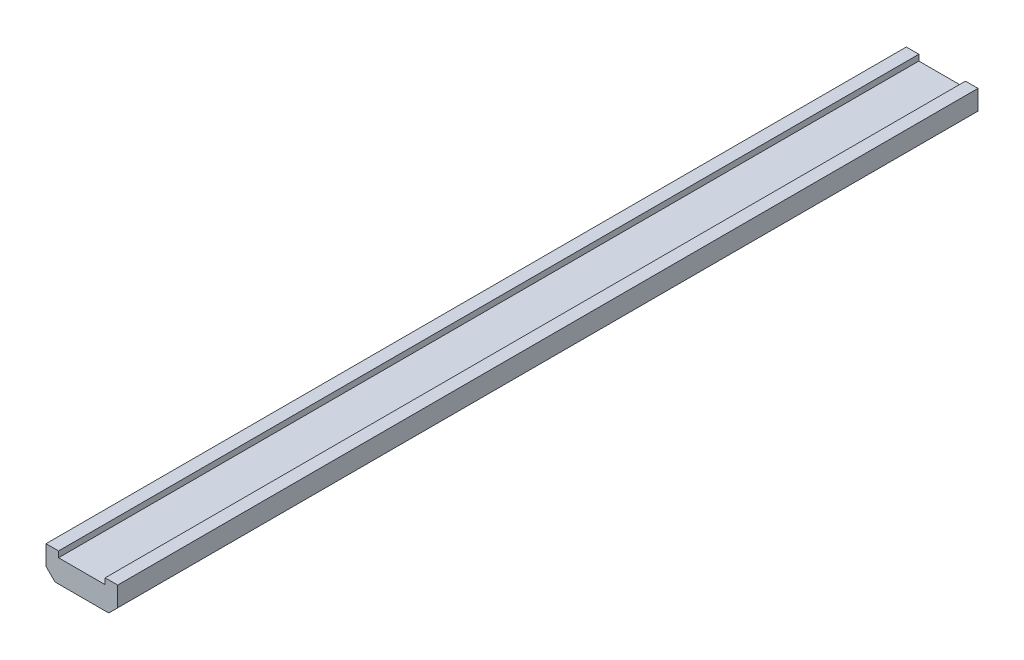
ISO-10303-21;
HEADER;
FILE_DESCRIPTION(('STEP AP214'),'2;1');
FILE_NAME('part.step','',(''),(''),'','','');
FILE_SCHEMA(('AUTOMOTIVE_DESIGN { 1 0 10303 214 1 1 1 1 }'));
ENDSEC;
DATA;
#1=APPLICATION_CONTEXT('core data for automotive mechanical design processes');
#2=APPLICATION_PROTOCOL_DEFINITION('international standard','automotive_design',2000,#1);
#3=PRODUCT_CONTEXT('',#1,'mechanical');
#4=PRODUCT('Part','Part','',(#3));
#5=PRODUCT_RELATED_PRODUCT_CATEGORY('part','',(#4));
#6=PRODUCT_DEFINITION_FORMATION('','',#4);
#7=PRODUCT_DEFINITION_CONTEXT('part definition',#1,'design');
#8=PRODUCT_DEFINITION('design','',#6,#7);
#9=PRODUCT_DEFINITION_SHAPE('','',#8);
#10=(LENGTH_UNIT() NAMED_UNIT(*) SI_UNIT(.MILLI.,.METRE.));
#11=(NAMED_UNIT(*) PLANE_ANGLE_UNIT() SI_UNIT($,.RADIAN.));
#12=(NAMED_UNIT(*) SI_UNIT($,.STERADIAN.) SOLID_ANGLE_UNIT());
#13=UNCERTAINTY_MEASURE_WITH_UNIT(LENGTH_MEASURE(1.E-05),#10,'distance_accuracy_value','');
#14=(GEOMETRIC_REPRESENTATION_CONTEXT(3) GLOBAL_UNCERTAINTY_ASSIGNED_CONTEXT((#13)) GLOBAL_UNIT_ASSIGNED_CONTEXT((#10,
#11,#12)) REPRESENTATION_CONTEXT('',''));
#15=CARTESIAN_POINT('',(0.,0.,0.));
#16=DIRECTION('',(0.,0.,1.));
#17=DIRECTION('',(1.,0.,0.));
#18=AXIS2_PLACEMENT_3D('',#15,#16,#17);
#19=CARTESIAN_POINT('',(0.,80.,0.));
#20=DIRECTION('',(0.,1.,0.));
#21=DIRECTION('',(0.,0.,1.));
#22=AXIS2_PLACEMENT_3D('',#19,#20,#21);
#23=PLANE('',#22);
#24=DIRECTION('',(0.,0.,-1.));
#25=VECTOR('',#24,1.);
#26=CARTESIAN_POINT('',(65.,80.,-1200.));
#27=LINE('',#26,#25);
#28=CARTESIAN_POINT('',(65.,80.,1200.));
#29=VERTEX_POINT('',#28);
#30=CARTESIAN_POINT('',(65.,80.,-1200.));
#31=VERTEX_POINT('',#30);
#32=EDGE_CURVE('E114',#29,#31,#27,.T.);
#33=ORIENTED_EDGE('',*,*,#32,.F.);
#34=DIRECTION('',(1.,0.,0.));
#35=VECTOR('',#34,1.);
#36=CARTESIAN_POINT('',(-99.9999999999999,80.,1200.));
#37=LINE('',#36,#35);
#38=CARTESIAN_POINT('',(100.,80.,1200.));
#39=VERTEX_POINT('',#38);
#40=EDGE_CURVE('E154',#29,#39,#37,.T.);
#41=ORIENTED_EDGE('',*,*,#40,.T.);
#42=DIRECTION('',(0.,0.,-1.));
#43=VECTOR('',#42,1.);
#44=CARTESIAN_POINT('',(99.9999999999999,80.,-1200.));
#45=LINE('',#44,#43);
#46=CARTESIAN_POINT('',(99.9999999999999,80.,-1200.));
#47=VERTEX_POINT('',#46);
#48=EDGE_CURVE('E145',#39,#47,#45,.T.);
#49=ORIENTED_EDGE('',*,*,#48,.T.);
#50=DIRECTION('',(-1.,0.,0.));
#51=VECTOR('',#50,1.);
#52=CARTESIAN_POINT('',(-100.,80.,-1200.));
#53=LINE('',#52,#51);
#54=EDGE_CURVE('E150',#47,#31,#53,.T.);
#55=ORIENTED_EDGE('',*,*,#54,.T.);
#56=EDGE_LOOP('',(#33,#41,#49,#55));
#57=FACE_BOUND('',#56,.T.);
#58=ADVANCED_FACE('F32',(#57),#23,.T.);
#59=CARTESIAN_POINT('',(99.9999999999999,80.,-1200.));
#60=DIRECTION('',(-1.,0.,0.));
#61=DIRECTION('',(0.,0.,1.));
#62=AXIS2_PLACEMENT_3D('',#59,#60,#61);
#63=PLANE('',#62);
#64=DIRECTION('',(0.,-1.,0.));
#65=VECTOR('',#64,1.);
#66=CARTESIAN_POINT('',(100.,80.,1200.));
#67=LINE('',#66,#65);
#68=CARTESIAN_POINT('',(100.,24.9999999999999,1200.));
#69=VERTEX_POINT('',#68);
#70=EDGE_CURVE('E158',#39,#69,#67,.T.);
#71=ORIENTED_EDGE('',*,*,#70,.T.);
#72=DIRECTION('',(0.,0.,-1.));
#73=VECTOR('',#72,1.);
#74=CARTESIAN_POINT('',(99.9999999999999,24.9999999999999,-1200.));
#75=LINE('',#74,#73);
#76=CARTESIAN_POINT('',(99.9999999999999,24.9999999999999,-1200.));
#77=VERTEX_POINT('',#76);
#78=EDGE_CURVE('E11',#69,#77,#75,.T.);
#79=ORIENTED_EDGE('',*,*,#78,.T.);
#80=DIRECTION('',(0.,-1.,0.));
#81=VECTOR('',#80,1.);
#82=CARTESIAN_POINT('',(99.9999999999999,80.,-1200.));
#83=LINE('',#82,#81);
#84=EDGE_CURVE('E171',#47,#77,#83,.T.);
#85=ORIENTED_EDGE('',*,*,#84,.F.);
#86=ORIENTED_EDGE('',*,*,#48,.F.);
#87=EDGE_LOOP('',(#71,#79,#85,#86));
#88=FACE_BOUND('',#87,.T.);
#89=ADVANCED_FACE('F207',(#88),#63,.F.);
#90=CARTESIAN_POINT('',(-100.,80.,-1200.));
#91=DIRECTION('',(0.,0.,1.));
#92=DIRECTION('',(1.,0.,0.));
#93=AXIS2_PLACEMENT_3D('',#90,#91,#92);
#94=PLANE('',#93);
#95=DIRECTION('',(-1.,0.,0.));
#96=VECTOR('',#95,1.);
#97=CARTESIAN_POINT('',(-65.,63.4825501799892,-1200.));
#98=LINE('',#97,#96);
#99=CARTESIAN_POINT('',(65.,63.4825501799892,-1200.));
#100=VERTEX_POINT('',#99);
#101=CARTESIAN_POINT('',(-65.,63.4825501799892,-1200.));
#102=VERTEX_POINT('',#101);
#103=EDGE_CURVE('E124',#100,#102,#98,.T.);
#104=ORIENTED_EDGE('',*,*,#103,.F.);
#105=DIRECTION('',(0.,1.,0.));
#106=VECTOR('',#105,1.);
#107=CARTESIAN_POINT('',(65.,63.4825501799892,-1200.));
#108=LINE('',#107,#106);
#109=EDGE_CURVE('E108',#100,#31,#108,.T.);
#110=ORIENTED_EDGE('',*,*,#109,.T.);
#111=ORIENTED_EDGE('',*,*,#54,.F.);
#112=ORIENTED_EDGE('',*,*,#84,.T.);
#113=DIRECTION('',(0.707106781186551,0.707106781186544,0.));
#114=VECTOR('',#113,1.);
#115=CARTESIAN_POINT('',(99.9999999999999,24.9999999999999,-1200.));
#116=LINE('',#115,#114);
#117=CARTESIAN_POINT('',(74.9999999999997,0.,-1200.));
#118=VERTEX_POINT('',#117);
#119=EDGE_CURVE('E55',#77,#118,#116,.F.);
#120=ORIENTED_EDGE('',*,*,#119,.T.);
#121=DIRECTION('',(-1.,0.,0.));
#122=VECTOR('',#121,1.);
#123=CARTESIAN_POINT('',(-100.,0.,-1200.));
#124=LINE('',#123,#122);
#125=CARTESIAN_POINT('',(-75.,0.,-1200.));
#126=VERTEX_POINT('',#125);
#127=EDGE_CURVE('E140',#118,#126,#124,.T.);
#128=ORIENTED_EDGE('',*,*,#127,.T.);
#129=DIRECTION('',(0.707106781186551,-0.707106781186544,0.));
#130=VECTOR('',#129,1.);
#131=CARTESIAN_POINT('',(-100.,24.9999999999999,-1200.));
#132=LINE('',#131,#130);
#133=CARTESIAN_POINT('',(-100.,24.9999999999999,-1200.));
#134=VERTEX_POINT('',#133);
#135=EDGE_CURVE('E40',#126,#134,#132,.F.);
#136=ORIENTED_EDGE('',*,*,#135,.T.);
#137=DIRECTION('',(0.,-1.,0.));
#138=VECTOR('',#137,1.);
#139=CARTESIAN_POINT('',(-100.,80.,-1200.));
#140=LINE('',#139,#138);
#141=CARTESIAN_POINT('',(-100.,80.,-1200.));
#142=VERTEX_POINT('',#141);
#143=EDGE_CURVE('E168',#142,#134,#140,.T.);
#144=ORIENTED_EDGE('',*,*,#143,.F.);
#145=CARTESIAN_POINT('',(-65.,80.,-1200.));
#146=VERTEX_POINT('',#145);
#147=EDGE_CURVE('E148',#146,#142,#53,.T.);
#148=ORIENTED_EDGE('',*,*,#147,.F.);
#149=DIRECTION('',(0.,1.,0.));
#150=VECTOR('',#149,1.);
#151=CARTESIAN_POINT('',(-65.,63.4825501799892,-1200.));
#152=LINE('',#151,#150);
#153=EDGE_CURVE('E47',#102,#146,#152,.T.);
#154=ORIENTED_EDGE('',*,*,#153,.F.);
#155=EDGE_LOOP('',(#104,#110,#111,#112,#120,#128,#136,#144,#148,#154));
#156=FACE_BOUND('',#155,.T.);
#157=ADVANCED_FACE('F129',(#156),#94,.F.);
#158=CARTESIAN_POINT('',(-100.,80.,-1200.));
#159=DIRECTION('',(1.,0.,0.));
#160=DIRECTION('',(0.,0.,-1.));
#161=AXIS2_PLACEMENT_3D('',#158,#159,#160);
#162=PLANE('',#161);
#163=ORIENTED_EDGE('',*,*,#143,.T.);
#164=DIRECTION('',(0.,0.,1.));
#165=VECTOR('',#164,1.);
#166=CARTESIAN_POINT('',(-100.,24.9999999999999,-1200.));
#167=LINE('',#166,#165);
#168=CARTESIAN_POINT('',(-99.9999999999999,24.9999999999999,1200.));
#169=VERTEX_POINT('',#168);
#170=EDGE_CURVE('E174',#134,#169,#167,.T.);
#171=ORIENTED_EDGE('',*,*,#170,.T.);
#172=DIRECTION('',(0.,-1.,0.));
#173=VECTOR('',#172,1.);
#174=CARTESIAN_POINT('',(-99.9999999999999,80.,1200.));
#175=LINE('',#174,#173);
#176=CARTESIAN_POINT('',(-99.9999999999999,80.,1200.));
#177=VERTEX_POINT('',#176);
#178=EDGE_CURVE('E165',#177,#169,#175,.T.);
#179=ORIENTED_EDGE('',*,*,#178,.F.);
#180=DIRECTION('',(0.,0.,1.));
#181=VECTOR('',#180,1.);
#182=CARTESIAN_POINT('',(-100.,80.,-1200.));
#183=LINE('',#182,#181);
#184=EDGE_CURVE('E152',#142,#177,#183,.T.);
#185=ORIENTED_EDGE('',*,*,#184,.F.);
#186=EDGE_LOOP('',(#163,#171,#179,#185));
#187=FACE_BOUND('',#186,.T.);
#188=ADVANCED_FACE('F193',(#187),#162,.F.);
#189=CARTESIAN_POINT('',(-99.9999999999999,80.,1200.));
#190=DIRECTION('',(0.,0.,-1.));
#191=DIRECTION('',(-1.,0.,0.));
#192=AXIS2_PLACEMENT_3D('',#189,#190,#191);
#193=PLANE('',#192);
#194=ORIENTED_EDGE('',*,*,#40,.F.);
#195=DIRECTION('',(0.,1.,0.));
#196=VECTOR('',#195,1.);
#197=CARTESIAN_POINT('',(65.,63.4825501799892,1200.));
#198=LINE('',#197,#196);
#199=CARTESIAN_POINT('',(65.,63.4825501799892,1200.));
#200=VERTEX_POINT('',#199);
#201=EDGE_CURVE('E138',#200,#29,#198,.T.);
#202=ORIENTED_EDGE('',*,*,#201,.F.);
#203=DIRECTION('',(1.,0.,0.));
#204=VECTOR('',#203,1.);
#205=CARTESIAN_POINT('',(-65.,63.4825501799892,1200.));
#206=LINE('',#205,#204);
#207=CARTESIAN_POINT('',(-65.,63.4825501799892,1200.));
#208=VERTEX_POINT('',#207);
#209=EDGE_CURVE('E118',#208,#200,#206,.T.);
#210=ORIENTED_EDGE('',*,*,#209,.F.);
#211=DIRECTION('',(0.,1.,0.));
#212=VECTOR('',#211,1.);
#213=CARTESIAN_POINT('',(-65.,63.4825501799892,1200.));
#214=LINE('',#213,#212);
#215=CARTESIAN_POINT('',(-65.,80.,1200.));
#216=VERTEX_POINT('',#215);
#217=EDGE_CURVE('E141',#208,#216,#214,.T.);
#218=ORIENTED_EDGE('',*,*,#217,.T.);
#219=EDGE_CURVE('E155',#177,#216,#37,.T.);
#220=ORIENTED_EDGE('',*,*,#219,.F.);
#221=ORIENTED_EDGE('',*,*,#178,.T.);
#222=DIRECTION('',(-0.707106781186551,0.707106781186544,0.));
#223=VECTOR('',#222,1.);
#224=CARTESIAN_POINT('',(-100.,25.0000000000001,1200.));
#225=LINE('',#224,#223);
#226=CARTESIAN_POINT('',(-74.9999999999997,0.,1200.));
#227=VERTEX_POINT('',#226);
#228=EDGE_CURVE('E179',#169,#227,#225,.F.);
#229=ORIENTED_EDGE('',*,*,#228,.T.);
#230=DIRECTION('',(1.,0.,0.));
#231=VECTOR('',#230,1.);
#232=CARTESIAN_POINT('',(-99.9999999999999,0.,1200.));
#233=LINE('',#232,#231);
#234=CARTESIAN_POINT('',(75.,0.,1200.));
#235=VERTEX_POINT('',#234);
#236=EDGE_CURVE('E149',#227,#235,#233,.T.);
#237=ORIENTED_EDGE('',*,*,#236,.T.);
#238=DIRECTION('',(-0.707106781186551,-0.707106781186544,0.));
#239=VECTOR('',#238,1.);
#240=CARTESIAN_POINT('',(100.,24.9999999999998,1200.));
#241=LINE('',#240,#239);
#242=EDGE_CURVE('E177',#235,#69,#241,.F.);
#243=ORIENTED_EDGE('',*,*,#242,.T.);
#244=ORIENTED_EDGE('',*,*,#70,.F.);
#245=EDGE_LOOP('',(#194,#202,#210,#218,#220,#221,#229,#237,#243,#244));
#246=FACE_BOUND('',#245,.T.);
#247=ADVANCED_FACE('F199',(#246),#193,.F.);
#248=DIRECTION('',(0.,0.,1.));
#249=VECTOR('',#248,1.);
#250=CARTESIAN_POINT('',(-65.,80.,-1200.));
#251=LINE('',#250,#249);
#252=EDGE_CURVE('E127',#146,#216,#251,.T.);
#253=ORIENTED_EDGE('',*,*,#252,.F.);
#254=ORIENTED_EDGE('',*,*,#147,.T.);
#255=ORIENTED_EDGE('',*,*,#184,.T.);
#256=ORIENTED_EDGE('',*,*,#219,.T.);
#257=EDGE_LOOP('',(#253,#254,#255,#256));
#258=FACE_BOUND('',#257,.T.);
#259=ADVANCED_FACE('F211',(#258),#23,.T.);
#260=CARTESIAN_POINT('',(0.,0.,0.));
#261=DIRECTION('',(0.,1.,0.));
#262=DIRECTION('',(0.,0.,1.));
#263=AXIS2_PLACEMENT_3D('',#260,#261,#262);
#264=PLANE('',#263);
#265=ORIENTED_EDGE('',*,*,#236,.F.);
#266=DIRECTION('',(0.,0.,-1.));
#267=VECTOR('',#266,1.);
#268=CARTESIAN_POINT('',(-74.9999999999999,0.,0.));
#269=LINE('',#268,#267);
#270=EDGE_CURVE('E183',#227,#126,#269,.T.);
#271=ORIENTED_EDGE('',*,*,#270,.T.);
#272=ORIENTED_EDGE('',*,*,#127,.F.);
#273=DIRECTION('',(0.,0.,1.));
#274=VECTOR('',#273,1.);
#275=CARTESIAN_POINT('',(74.9999999999999,0.,0.));
#276=LINE('',#275,#274);
#277=EDGE_CURVE('E181',#118,#235,#276,.T.);
#278=ORIENTED_EDGE('',*,*,#277,.T.);
#279=EDGE_LOOP('',(#265,#271,#272,#278));
#280=FACE_BOUND('',#279,.T.);
#281=ADVANCED_FACE('F203',(#280),#264,.F.);
#282=CARTESIAN_POINT('',(-100.,24.9999999999999,-1200.));
#283=DIRECTION('',(0.707106781186544,0.707106781186551,0.));
#284=DIRECTION('',(0.,0.,1.));
#285=AXIS2_PLACEMENT_3D('',#282,#283,#284);
#286=PLANE('',#285);
#287=ORIENTED_EDGE('',*,*,#135,.F.);
#288=ORIENTED_EDGE('',*,*,#270,.F.);
#289=ORIENTED_EDGE('',*,*,#228,.F.);
#290=ORIENTED_EDGE('',*,*,#170,.F.);
#291=EDGE_LOOP('',(#287,#288,#289,#290));
#292=FACE_BOUND('',#291,.T.);
#293=ADVANCED_FACE('F195',(#292),#286,.F.);
#294=CARTESIAN_POINT('',(99.9999999999999,24.9999999999999,-1200.));
#295=DIRECTION('',(-0.707106781186544,0.707106781186551,0.));
#296=DIRECTION('',(0.,0.,-1.));
#297=AXIS2_PLACEMENT_3D('',#294,#295,#296);
#298=PLANE('',#297);
#299=ORIENTED_EDGE('',*,*,#242,.F.);
#300=ORIENTED_EDGE('',*,*,#277,.F.);
#301=ORIENTED_EDGE('',*,*,#119,.F.);
#302=ORIENTED_EDGE('',*,*,#78,.F.);
#303=EDGE_LOOP('',(#299,#300,#301,#302));
#304=FACE_BOUND('',#303,.T.);
#305=ADVANCED_FACE('F34',(#304),#298,.F.);
#306=CARTESIAN_POINT('',(65.,63.4825501799892,-1200.));
#307=DIRECTION('',(1.,0.,0.));
#308=DIRECTION('',(0.,0.,-1.));
#309=AXIS2_PLACEMENT_3D('',#306,#307,#308);
#310=PLANE('',#309);
#311=ORIENTED_EDGE('',*,*,#32,.T.);
#312=ORIENTED_EDGE('',*,*,#109,.F.);
#313=DIRECTION('',(0.,0.,-1.));
#314=VECTOR('',#313,1.);
#315=CARTESIAN_POINT('',(65.,63.4825501799892,-1200.));
#316=LINE('',#315,#314);
#317=EDGE_CURVE('E111',#200,#100,#316,.T.);
#318=ORIENTED_EDGE('',*,*,#317,.F.);
#319=ORIENTED_EDGE('',*,*,#201,.T.);
#320=EDGE_LOOP('',(#311,#312,#318,#319));
#321=FACE_BOUND('',#320,.T.);
#322=ADVANCED_FACE('F110',(#321),#310,.F.);
#323=CARTESIAN_POINT('',(-65.,63.4825501799892,-1200.));
#324=DIRECTION('',(-1.,0.,0.));
#325=DIRECTION('',(0.,0.,1.));
#326=AXIS2_PLACEMENT_3D('',#323,#324,#325);
#327=PLANE('',#326);
#328=ORIENTED_EDGE('',*,*,#252,.T.);
#329=ORIENTED_EDGE('',*,*,#217,.F.);
#330=DIRECTION('',(0.,0.,1.));
#331=VECTOR('',#330,1.);
#332=CARTESIAN_POINT('',(-65.,63.4825501799892,-1200.));
#333=LINE('',#332,#331);
#334=EDGE_CURVE('E131',#102,#208,#333,.T.);
#335=ORIENTED_EDGE('',*,*,#334,.F.);
#336=ORIENTED_EDGE('',*,*,#153,.T.);
#337=EDGE_LOOP('',(#328,#329,#335,#336));
#338=FACE_BOUND('',#337,.T.);
#339=ADVANCED_FACE('F212',(#338),#327,.F.);
#340=CARTESIAN_POINT('',(0.,63.4825501799892,0.));
#341=DIRECTION('',(0.,1.,0.));
#342=DIRECTION('',(0.,0.,1.));
#343=AXIS2_PLACEMENT_3D('',#340,#341,#342);
#344=PLANE('',#343);
#345=ORIENTED_EDGE('',*,*,#317,.T.);
#346=ORIENTED_EDGE('',*,*,#103,.T.);
#347=ORIENTED_EDGE('',*,*,#334,.T.);
#348=ORIENTED_EDGE('',*,*,#209,.T.);
#349=EDGE_LOOP('',(#345,#346,#347,#348));
#350=FACE_BOUND('',#349,.T.);
#351=ADVANCED_FACE('F122',(#350),#344,.T.);
#352=CLOSED_SHELL('',(#58,#89,#157,#188,#247,#259,#281,#293,#305,#322,#339,#351));
#353=MANIFOLD_SOLID_BREP('B2',#352);
#354=ADVANCED_BREP_SHAPE_REPRESENTATION('',(#18,#353),#14);
#355=SHAPE_DEFINITION_REPRESENTATION(#9,#354);
ENDSEC;
END-ISO-10303-21;
